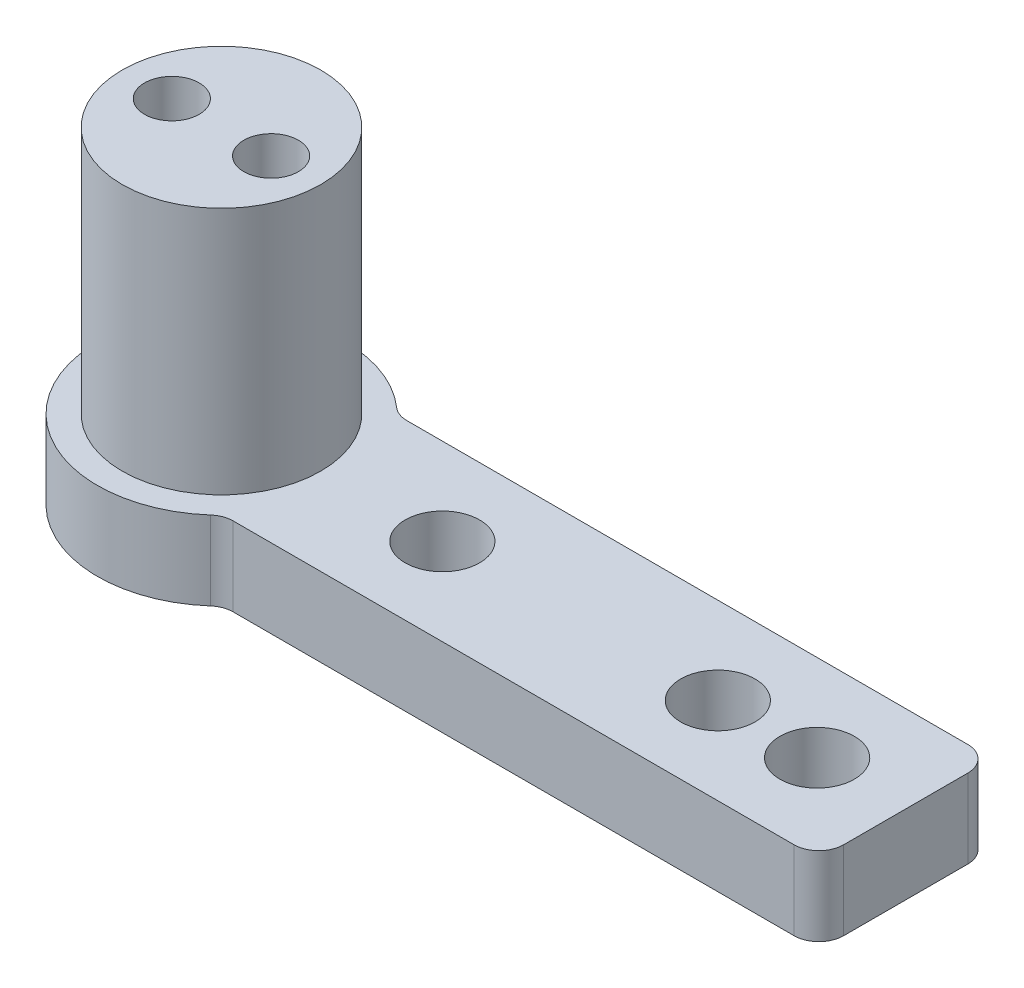
ISO-10303-21;
HEADER;
FILE_DESCRIPTION(('STEP AP214'),'2;1');
FILE_NAME('part.step','',(''),(''),'','','');
FILE_SCHEMA(('AUTOMOTIVE_DESIGN { 1 0 10303 214 1 1 1 1 }'));
ENDSEC;
DATA;
#1=APPLICATION_CONTEXT('core data for automotive mechanical design processes');
#2=APPLICATION_PROTOCOL_DEFINITION('international standard','automotive_design',2000,#1);
#3=PRODUCT_CONTEXT('',#1,'mechanical');
#4=PRODUCT('Part','Part','',(#3));
#5=PRODUCT_RELATED_PRODUCT_CATEGORY('part','',(#4));
#6=PRODUCT_DEFINITION_FORMATION('','',#4);
#7=PRODUCT_DEFINITION_CONTEXT('part definition',#1,'design');
#8=PRODUCT_DEFINITION('design','',#6,#7);
#9=PRODUCT_DEFINITION_SHAPE('','',#8);
#10=(LENGTH_UNIT() NAMED_UNIT(*) SI_UNIT(.MILLI.,.METRE.));
#11=(NAMED_UNIT(*) PLANE_ANGLE_UNIT() SI_UNIT($,.RADIAN.));
#12=(NAMED_UNIT(*) SI_UNIT($,.STERADIAN.) SOLID_ANGLE_UNIT());
#13=UNCERTAINTY_MEASURE_WITH_UNIT(LENGTH_MEASURE(1.E-05),#10,'distance_accuracy_value','');
#14=(GEOMETRIC_REPRESENTATION_CONTEXT(3) GLOBAL_UNCERTAINTY_ASSIGNED_CONTEXT((#13)) GLOBAL_UNIT_ASSIGNED_CONTEXT((#10,
#11,#12)) REPRESENTATION_CONTEXT('',''));
#15=CARTESIAN_POINT('',(0.,0.,0.));
#16=DIRECTION('',(0.,0.,1.));
#17=DIRECTION('',(1.,0.,0.));
#18=AXIS2_PLACEMENT_3D('',#15,#16,#17);
#19=CARTESIAN_POINT('',(0.,3.175,0.));
#20=DIRECTION('',(0.,1.,0.));
#21=DIRECTION('',(0.,0.,1.));
#22=AXIS2_PLACEMENT_3D('',#19,#20,#21);
#23=PLANE('',#22);
#24=CARTESIAN_POINT('',(0.,3.175,0.));
#25=DIRECTION('',(0.,1.,0.));
#26=DIRECTION('',(0.,0.,1.));
#27=AXIS2_PLACEMENT_3D('',#24,#25,#26);
#28=CIRCLE('',#27,4.);
#29=CARTESIAN_POINT('',(0.,3.175,4.));
#30=VERTEX_POINT('',#29);
#31=EDGE_CURVE('E190',#30,#30,#28,.T.);
#32=ORIENTED_EDGE('',*,*,#31,.F.);
#33=EDGE_LOOP('',(#32));
#34=FACE_BOUND('',#33,.T.);
#35=CARTESIAN_POINT('',(20.,3.175,0.));
#36=DIRECTION('',(0.,1.,0.));
#37=DIRECTION('',(0.,0.,1.));
#38=AXIS2_PLACEMENT_3D('',#35,#36,#37);
#39=CIRCLE('',#38,1.5);
#40=CARTESIAN_POINT('',(20.,3.175,1.5));
#41=VERTEX_POINT('',#40);
#42=EDGE_CURVE('E176',#41,#41,#39,.T.);
#43=ORIENTED_EDGE('',*,*,#42,.F.);
#44=EDGE_LOOP('',(#43));
#45=FACE_BOUND('',#44,.T.);
#46=DIRECTION('',(0.,0.,-1.));
#47=VECTOR('',#46,1.);
#48=CARTESIAN_POINT('',(27.5707142142714,3.175,-3.5));
#49=LINE('',#48,#47);
#50=CARTESIAN_POINT('',(27.5707142142714,3.175,2.5));
#51=VERTEX_POINT('',#50);
#52=CARTESIAN_POINT('',(27.5707142142714,3.175,-2.5));
#53=VERTEX_POINT('',#52);
#54=EDGE_CURVE('E129',#51,#53,#49,.T.);
#55=ORIENTED_EDGE('',*,*,#54,.T.);
#56=CARTESIAN_POINT('',(26.5707142142714,3.175,-2.5));
#57=DIRECTION('',(0.,1.,0.));
#58=DIRECTION('',(0.,0.,1.));
#59=AXIS2_PLACEMENT_3D('',#56,#57,#58);
#60=CIRCLE('',#59,1.);
#61=CARTESIAN_POINT('',(26.5707142142714,3.175,-3.5));
#62=VERTEX_POINT('',#61);
#63=EDGE_CURVE('E109',#53,#62,#60,.T.);
#64=ORIENTED_EDGE('',*,*,#63,.T.);
#65=DIRECTION('',(-1.,0.,0.));
#66=VECTOR('',#65,1.);
#67=CARTESIAN_POINT('',(3.57071421427143,3.175,-3.5));
#68=LINE('',#67,#66);
#69=CARTESIAN_POINT('',(3.96862696659689,3.175,-3.5));
#70=VERTEX_POINT('',#69);
#71=EDGE_CURVE('E159',#62,#70,#68,.T.);
#72=ORIENTED_EDGE('',*,*,#71,.T.);
#73=CARTESIAN_POINT('',(3.96862696659689,3.175,-4.5));
#74=DIRECTION('',(0.,1.,0.));
#75=DIRECTION('',(0.,0.,1.));
#76=AXIS2_PLACEMENT_3D('',#73,#74,#75);
#77=CIRCLE('',#76,1.);
#78=CARTESIAN_POINT('',(3.30718913883074,3.175,-3.75));
#79=VERTEX_POINT('',#78);
#80=EDGE_CURVE('E108',#70,#79,#77,.F.);
#81=ORIENTED_EDGE('',*,*,#80,.T.);
#82=CARTESIAN_POINT('',(0.,3.175,0.));
#83=DIRECTION('',(0.,1.,0.));
#84=DIRECTION('',(0.,0.,1.));
#85=AXIS2_PLACEMENT_3D('',#82,#83,#84);
#86=CIRCLE('',#85,5.);
#87=CARTESIAN_POINT('',(3.30718913883074,3.175,3.75));
#88=VERTEX_POINT('',#87);
#89=EDGE_CURVE('E118',#79,#88,#86,.T.);
#90=ORIENTED_EDGE('',*,*,#89,.T.);
#91=CARTESIAN_POINT('',(3.96862696659689,3.175,4.5));
#92=DIRECTION('',(0.,1.,0.));
#93=DIRECTION('',(0.,0.,1.));
#94=AXIS2_PLACEMENT_3D('',#91,#92,#93);
#95=CIRCLE('',#94,1.);
#96=CARTESIAN_POINT('',(3.96862696659689,3.175,3.5));
#97=VERTEX_POINT('',#96);
#98=EDGE_CURVE('E11',#88,#97,#95,.F.);
#99=ORIENTED_EDGE('',*,*,#98,.T.);
#100=DIRECTION('',(1.,0.,0.));
#101=VECTOR('',#100,1.);
#102=CARTESIAN_POINT('',(3.57071421427143,3.175,3.5));
#103=LINE('',#102,#101);
#104=CARTESIAN_POINT('',(26.5707142142714,3.175,3.5));
#105=VERTEX_POINT('',#104);
#106=EDGE_CURVE('E135',#97,#105,#103,.T.);
#107=ORIENTED_EDGE('',*,*,#106,.T.);
#108=CARTESIAN_POINT('',(26.5707142142714,3.175,2.5));
#109=DIRECTION('',(0.,1.,0.));
#110=DIRECTION('',(0.,0.,1.));
#111=AXIS2_PLACEMENT_3D('',#108,#109,#110);
#112=CIRCLE('',#111,1.);
#113=EDGE_CURVE('E54',#105,#51,#112,.T.);
#114=ORIENTED_EDGE('',*,*,#113,.T.);
#115=EDGE_LOOP('',(#55,#64,#72,#81,#90,#99,#107,#114));
#116=FACE_BOUND('',#115,.T.);
#117=CARTESIAN_POINT('',(8.9,3.175,0.));
#118=DIRECTION('',(0.,1.,0.));
#119=DIRECTION('',(0.,0.,1.));
#120=AXIS2_PLACEMENT_3D('',#117,#118,#119);
#121=CIRCLE('',#120,1.5);
#122=CARTESIAN_POINT('',(8.9,3.175,1.5));
#123=VERTEX_POINT('',#122);
#124=EDGE_CURVE('E168',#123,#123,#121,.T.);
#125=ORIENTED_EDGE('',*,*,#124,.F.);
#126=EDGE_LOOP('',(#125));
#127=FACE_BOUND('',#126,.T.);
#128=CARTESIAN_POINT('',(24.,3.175,0.));
#129=DIRECTION('',(0.,1.,0.));
#130=DIRECTION('',(0.,0.,1.));
#131=AXIS2_PLACEMENT_3D('',#128,#129,#130);
#132=CIRCLE('',#131,1.5);
#133=CARTESIAN_POINT('',(24.,3.175,1.5));
#134=VERTEX_POINT('',#133);
#135=EDGE_CURVE('E181',#134,#134,#132,.T.);
#136=ORIENTED_EDGE('',*,*,#135,.F.);
#137=EDGE_LOOP('',(#136));
#138=FACE_BOUND('',#137,.T.);
#139=ADVANCED_FACE('F32',(#34,#45,#116,#127,#138),#23,.T.);
#140=CARTESIAN_POINT('',(0.,0.,0.));
#141=DIRECTION('',(0.,1.,0.));
#142=DIRECTION('',(0.,0.,1.));
#143=AXIS2_PLACEMENT_3D('',#140,#141,#142);
#144=PLANE('',#143);
#145=DIRECTION('',(-1.,0.,0.));
#146=VECTOR('',#145,1.);
#147=CARTESIAN_POINT('',(3.57071421427143,0.,-3.5));
#148=LINE('',#147,#146);
#149=CARTESIAN_POINT('',(26.5707142142714,0.,-3.5));
#150=VERTEX_POINT('',#149);
#151=CARTESIAN_POINT('',(3.96862696659689,0.,-3.5));
#152=VERTEX_POINT('',#151);
#153=EDGE_CURVE('E126',#150,#152,#148,.T.);
#154=ORIENTED_EDGE('',*,*,#153,.F.);
#155=CARTESIAN_POINT('',(26.5707142142714,0.,-2.5));
#156=DIRECTION('',(0.,1.,0.));
#157=DIRECTION('',(0.,0.,1.));
#158=AXIS2_PLACEMENT_3D('',#155,#156,#157);
#159=CIRCLE('',#158,1.);
#160=CARTESIAN_POINT('',(27.5707142142714,0.,-2.5));
#161=VERTEX_POINT('',#160);
#162=EDGE_CURVE('E147',#150,#161,#159,.F.);
#163=ORIENTED_EDGE('',*,*,#162,.T.);
#164=DIRECTION('',(0.,0.,-1.));
#165=VECTOR('',#164,1.);
#166=CARTESIAN_POINT('',(27.5707142142714,0.,-3.5));
#167=LINE('',#166,#165);
#168=CARTESIAN_POINT('',(27.5707142142714,0.,2.5));
#169=VERTEX_POINT('',#168);
#170=EDGE_CURVE('E131',#169,#161,#167,.T.);
#171=ORIENTED_EDGE('',*,*,#170,.F.);
#172=CARTESIAN_POINT('',(26.5707142142714,0.,2.5));
#173=DIRECTION('',(0.,1.,0.));
#174=DIRECTION('',(0.,0.,1.));
#175=AXIS2_PLACEMENT_3D('',#172,#173,#174);
#176=CIRCLE('',#175,1.);
#177=CARTESIAN_POINT('',(26.5707142142714,0.,3.5));
#178=VERTEX_POINT('',#177);
#179=EDGE_CURVE('E145',#169,#178,#176,.F.);
#180=ORIENTED_EDGE('',*,*,#179,.T.);
#181=DIRECTION('',(1.,0.,0.));
#182=VECTOR('',#181,1.);
#183=CARTESIAN_POINT('',(3.57071421427143,0.,3.5));
#184=LINE('',#183,#182);
#185=CARTESIAN_POINT('',(3.96862696659689,0.,3.5));
#186=VERTEX_POINT('',#185);
#187=EDGE_CURVE('E125',#186,#178,#184,.T.);
#188=ORIENTED_EDGE('',*,*,#187,.F.);
#189=CARTESIAN_POINT('',(3.96862696659689,0.,4.5));
#190=DIRECTION('',(0.,1.,0.));
#191=DIRECTION('',(0.,0.,1.));
#192=AXIS2_PLACEMENT_3D('',#189,#190,#191);
#193=CIRCLE('',#192,1.);
#194=CARTESIAN_POINT('',(3.30718913883074,0.,3.75));
#195=VERTEX_POINT('',#194);
#196=EDGE_CURVE('E40',#186,#195,#193,.T.);
#197=ORIENTED_EDGE('',*,*,#196,.T.);
#198=CARTESIAN_POINT('',(0.,0.,0.));
#199=DIRECTION('',(0.,1.,0.));
#200=DIRECTION('',(0.,0.,1.));
#201=AXIS2_PLACEMENT_3D('',#198,#199,#200);
#202=CIRCLE('',#201,5.);
#203=CARTESIAN_POINT('',(3.30718913883074,0.,-3.75));
#204=VERTEX_POINT('',#203);
#205=EDGE_CURVE('E115',#204,#195,#202,.T.);
#206=ORIENTED_EDGE('',*,*,#205,.F.);
#207=CARTESIAN_POINT('',(3.96862696659689,0.,-4.5));
#208=DIRECTION('',(0.,1.,0.));
#209=DIRECTION('',(0.,0.,1.));
#210=AXIS2_PLACEMENT_3D('',#207,#208,#209);
#211=CIRCLE('',#210,1.);
#212=EDGE_CURVE('E98',#204,#152,#211,.T.);
#213=ORIENTED_EDGE('',*,*,#212,.T.);
#214=EDGE_LOOP('',(#154,#163,#171,#180,#188,#197,#206,#213));
#215=FACE_BOUND('',#214,.T.);
#216=CARTESIAN_POINT('',(8.9,0.,0.));
#217=DIRECTION('',(0.,1.,0.));
#218=DIRECTION('',(0.,0.,1.));
#219=AXIS2_PLACEMENT_3D('',#216,#217,#218);
#220=CIRCLE('',#219,1.5);
#221=CARTESIAN_POINT('',(8.9,0.,1.5));
#222=VERTEX_POINT('',#221);
#223=EDGE_CURVE('E171',#222,#222,#220,.T.);
#224=ORIENTED_EDGE('',*,*,#223,.T.);
#225=EDGE_LOOP('',(#224));
#226=FACE_BOUND('',#225,.T.);
#227=CARTESIAN_POINT('',(20.,0.,0.));
#228=DIRECTION('',(0.,1.,0.));
#229=DIRECTION('',(0.,0.,1.));
#230=AXIS2_PLACEMENT_3D('',#227,#228,#229);
#231=CIRCLE('',#230,1.5);
#232=CARTESIAN_POINT('',(20.,0.,1.5));
#233=VERTEX_POINT('',#232);
#234=EDGE_CURVE('E178',#233,#233,#231,.T.);
#235=ORIENTED_EDGE('',*,*,#234,.T.);
#236=EDGE_LOOP('',(#235));
#237=FACE_BOUND('',#236,.T.);
#238=CARTESIAN_POINT('',(24.,0.,0.));
#239=DIRECTION('',(0.,1.,0.));
#240=DIRECTION('',(0.,0.,1.));
#241=AXIS2_PLACEMENT_3D('',#238,#239,#240);
#242=CIRCLE('',#241,1.5);
#243=CARTESIAN_POINT('',(24.,0.,1.5));
#244=VERTEX_POINT('',#243);
#245=EDGE_CURVE('E184',#244,#244,#242,.T.);
#246=ORIENTED_EDGE('',*,*,#245,.T.);
#247=EDGE_LOOP('',(#246));
#248=FACE_BOUND('',#247,.T.);
#249=ADVANCED_FACE('F122',(#215,#226,#237,#248),#144,.F.);
#250=CARTESIAN_POINT('',(27.5707142142714,3.175,-3.5));
#251=DIRECTION('',(-1.,0.,0.));
#252=DIRECTION('',(0.,0.,1.));
#253=AXIS2_PLACEMENT_3D('',#250,#251,#252);
#254=PLANE('',#253);
#255=ORIENTED_EDGE('',*,*,#170,.T.);
#256=DIRECTION('',(0.,-1.,0.));
#257=VECTOR('',#256,1.);
#258=CARTESIAN_POINT('',(27.5707142142714,3.175,-2.5));
#259=LINE('',#258,#257);
#260=EDGE_CURVE('E47',#161,#53,#259,.F.);
#261=ORIENTED_EDGE('',*,*,#260,.T.);
#262=ORIENTED_EDGE('',*,*,#54,.F.);
#263=DIRECTION('',(0.,-1.,0.));
#264=VECTOR('',#263,1.);
#265=CARTESIAN_POINT('',(27.5707142142714,3.175,2.5));
#266=LINE('',#265,#264);
#267=EDGE_CURVE('E149',#51,#169,#266,.T.);
#268=ORIENTED_EDGE('',*,*,#267,.T.);
#269=EDGE_LOOP('',(#255,#261,#262,#268));
#270=FACE_BOUND('',#269,.T.);
#271=ADVANCED_FACE('F246',(#270),#254,.F.);
#272=CARTESIAN_POINT('',(3.57071421427143,3.175,-3.5));
#273=DIRECTION('',(0.,0.,1.));
#274=DIRECTION('',(1.,0.,0.));
#275=AXIS2_PLACEMENT_3D('',#272,#273,#274);
#276=PLANE('',#275);
#277=ORIENTED_EDGE('',*,*,#153,.T.);
#278=DIRECTION('',(0.,1.,0.));
#279=VECTOR('',#278,1.);
#280=CARTESIAN_POINT('',(3.96862696659689,3.175,-3.5));
#281=LINE('',#280,#279);
#282=EDGE_CURVE('E103',#152,#70,#281,.T.);
#283=ORIENTED_EDGE('',*,*,#282,.T.);
#284=ORIENTED_EDGE('',*,*,#71,.F.);
#285=DIRECTION('',(0.,-1.,0.));
#286=VECTOR('',#285,1.);
#287=CARTESIAN_POINT('',(26.5707142142714,3.175,-3.5));
#288=LINE('',#287,#286);
#289=EDGE_CURVE('E119',#62,#150,#288,.T.);
#290=ORIENTED_EDGE('',*,*,#289,.T.);
#291=EDGE_LOOP('',(#277,#283,#284,#290));
#292=FACE_BOUND('',#291,.T.);
#293=ADVANCED_FACE('F264',(#292),#276,.F.);
#294=CARTESIAN_POINT('',(0.,3.175,0.));
#295=DIRECTION('',(0.,-1.,0.));
#296=DIRECTION('',(0.,0.,-1.));
#297=AXIS2_PLACEMENT_3D('',#294,#295,#296);
#298=CYLINDRICAL_SURFACE('',#297,5.);
#299=ORIENTED_EDGE('',*,*,#89,.F.);
#300=DIRECTION('',(0.,-1.,0.));
#301=VECTOR('',#300,1.);
#302=CARTESIAN_POINT('',(3.30718913883074,3.175,-3.75));
#303=LINE('',#302,#301);
#304=EDGE_CURVE('E102',#79,#204,#303,.T.);
#305=ORIENTED_EDGE('',*,*,#304,.T.);
#306=ORIENTED_EDGE('',*,*,#205,.T.);
#307=DIRECTION('',(0.,-1.,0.));
#308=VECTOR('',#307,1.);
#309=CARTESIAN_POINT('',(3.30718913883074,3.175,3.75));
#310=LINE('',#309,#308);
#311=EDGE_CURVE('E120',#195,#88,#310,.F.);
#312=ORIENTED_EDGE('',*,*,#311,.T.);
#313=EDGE_LOOP('',(#299,#305,#306,#312));
#314=FACE_BOUND('',#313,.T.);
#315=ADVANCED_FACE('F114',(#314),#298,.T.);
#316=CARTESIAN_POINT('',(3.57071421427143,3.175,3.5));
#317=DIRECTION('',(0.,0.,-1.));
#318=DIRECTION('',(-1.,0.,0.));
#319=AXIS2_PLACEMENT_3D('',#316,#317,#318);
#320=PLANE('',#319);
#321=ORIENTED_EDGE('',*,*,#106,.F.);
#322=DIRECTION('',(0.,1.,0.));
#323=VECTOR('',#322,1.);
#324=CARTESIAN_POINT('',(3.96862696659689,0.,3.5));
#325=LINE('',#324,#323);
#326=EDGE_CURVE('E142',#97,#186,#325,.F.);
#327=ORIENTED_EDGE('',*,*,#326,.T.);
#328=ORIENTED_EDGE('',*,*,#187,.T.);
#329=DIRECTION('',(0.,-1.,0.));
#330=VECTOR('',#329,1.);
#331=CARTESIAN_POINT('',(26.5707142142714,3.175,3.5));
#332=LINE('',#331,#330);
#333=EDGE_CURVE('E140',#178,#105,#332,.F.);
#334=ORIENTED_EDGE('',*,*,#333,.T.);
#335=EDGE_LOOP('',(#321,#327,#328,#334));
#336=FACE_BOUND('',#335,.T.);
#337=ADVANCED_FACE('F257',(#336),#320,.F.);
#338=CARTESIAN_POINT('',(8.9,3.175,0.));
#339=DIRECTION('',(0.,-1.,0.));
#340=DIRECTION('',(0.,0.,-1.));
#341=AXIS2_PLACEMENT_3D('',#338,#339,#340);
#342=CYLINDRICAL_SURFACE('',#341,1.5);
#343=ORIENTED_EDGE('',*,*,#124,.T.);
#344=EDGE_LOOP('',(#343));
#345=FACE_BOUND('',#344,.T.);
#346=ORIENTED_EDGE('',*,*,#223,.F.);
#347=EDGE_LOOP('',(#346));
#348=FACE_BOUND('',#347,.T.);
#349=ADVANCED_FACE('F240',(#345,#348),#342,.F.);
#350=CARTESIAN_POINT('',(20.,3.175,0.));
#351=DIRECTION('',(0.,-1.,0.));
#352=DIRECTION('',(0.,0.,-1.));
#353=AXIS2_PLACEMENT_3D('',#350,#351,#352);
#354=CYLINDRICAL_SURFACE('',#353,1.5);
#355=ORIENTED_EDGE('',*,*,#42,.T.);
#356=EDGE_LOOP('',(#355));
#357=FACE_BOUND('',#356,.T.);
#358=ORIENTED_EDGE('',*,*,#234,.F.);
#359=EDGE_LOOP('',(#358));
#360=FACE_BOUND('',#359,.T.);
#361=ADVANCED_FACE('F237',(#357,#360),#354,.F.);
#362=CARTESIAN_POINT('',(24.,3.175,0.));
#363=DIRECTION('',(0.,-1.,0.));
#364=DIRECTION('',(0.,0.,-1.));
#365=AXIS2_PLACEMENT_3D('',#362,#363,#364);
#366=CYLINDRICAL_SURFACE('',#365,1.5);
#367=ORIENTED_EDGE('',*,*,#135,.T.);
#368=EDGE_LOOP('',(#367));
#369=FACE_BOUND('',#368,.T.);
#370=ORIENTED_EDGE('',*,*,#245,.F.);
#371=EDGE_LOOP('',(#370));
#372=FACE_BOUND('',#371,.T.);
#373=ADVANCED_FACE('F228',(#369,#372),#366,.F.);
#374=CARTESIAN_POINT('',(0.,13.175,0.));
#375=DIRECTION('',(0.,-1.,0.));
#376=DIRECTION('',(0.,0.,-1.));
#377=AXIS2_PLACEMENT_3D('',#374,#375,#376);
#378=CYLINDRICAL_SURFACE('',#377,4.);
#379=CARTESIAN_POINT('',(0.,13.175,0.));
#380=DIRECTION('',(0.,1.,0.));
#381=DIRECTION('',(0.,0.,1.));
#382=AXIS2_PLACEMENT_3D('',#379,#380,#381);
#383=CIRCLE('',#382,4.);
#384=CARTESIAN_POINT('',(0.,13.175,4.));
#385=VERTEX_POINT('',#384);
#386=EDGE_CURVE('E187',#385,#385,#383,.T.);
#387=ORIENTED_EDGE('',*,*,#386,.F.);
#388=EDGE_LOOP('',(#387));
#389=FACE_BOUND('',#388,.T.);
#390=ORIENTED_EDGE('',*,*,#31,.T.);
#391=EDGE_LOOP('',(#390));
#392=FACE_BOUND('',#391,.T.);
#393=ADVANCED_FACE('F220',(#389,#392),#378,.T.);
#394=CARTESIAN_POINT('',(0.,13.175,0.));
#395=DIRECTION('',(0.,1.,0.));
#396=DIRECTION('',(0.,0.,1.));
#397=AXIS2_PLACEMENT_3D('',#394,#395,#396);
#398=PLANE('',#397);
#399=CARTESIAN_POINT('',(2.,13.175,0.));
#400=DIRECTION('',(0.,1.,0.));
#401=DIRECTION('',(0.,0.,1.));
#402=AXIS2_PLACEMENT_3D('',#399,#400,#401);
#403=CIRCLE('',#402,1.1);
#404=CARTESIAN_POINT('',(2.,13.175,1.1));
#405=VERTEX_POINT('',#404);
#406=EDGE_CURVE('E202',#405,#405,#403,.T.);
#407=ORIENTED_EDGE('',*,*,#406,.F.);
#408=EDGE_LOOP('',(#407));
#409=FACE_BOUND('',#408,.T.);
#410=CARTESIAN_POINT('',(-2.,13.175,0.));
#411=DIRECTION('',(0.,1.,0.));
#412=DIRECTION('',(0.,0.,1.));
#413=AXIS2_PLACEMENT_3D('',#410,#411,#412);
#414=CIRCLE('',#413,1.1);
#415=CARTESIAN_POINT('',(-2.,13.175,1.1));
#416=VERTEX_POINT('',#415);
#417=EDGE_CURVE('E196',#416,#416,#414,.T.);
#418=ORIENTED_EDGE('',*,*,#417,.F.);
#419=EDGE_LOOP('',(#418));
#420=FACE_BOUND('',#419,.T.);
#421=ORIENTED_EDGE('',*,*,#386,.T.);
#422=EDGE_LOOP('',(#421));
#423=FACE_BOUND('',#422,.T.);
#424=ADVANCED_FACE('F217',(#409,#420,#423),#398,.T.);
#425=CARTESIAN_POINT('',(3.96862696659689,3.175,-4.5));
#426=DIRECTION('',(0.,-1.,0.));
#427=DIRECTION('',(0.,0.,-1.));
#428=AXIS2_PLACEMENT_3D('',#425,#426,#427);
#429=CYLINDRICAL_SURFACE('',#428,1.);
#430=ORIENTED_EDGE('',*,*,#80,.F.);
#431=ORIENTED_EDGE('',*,*,#282,.F.);
#432=ORIENTED_EDGE('',*,*,#212,.F.);
#433=ORIENTED_EDGE('',*,*,#304,.F.);
#434=EDGE_LOOP('',(#430,#431,#432,#433));
#435=FACE_BOUND('',#434,.T.);
#436=ADVANCED_FACE('F101',(#435),#429,.F.);
#437=CARTESIAN_POINT('',(3.96862696659689,3.175,4.5));
#438=DIRECTION('',(0.,-1.,0.));
#439=DIRECTION('',(0.,0.,-1.));
#440=AXIS2_PLACEMENT_3D('',#437,#438,#439);
#441=CYLINDRICAL_SURFACE('',#440,1.);
#442=ORIENTED_EDGE('',*,*,#98,.F.);
#443=ORIENTED_EDGE('',*,*,#311,.F.);
#444=ORIENTED_EDGE('',*,*,#196,.F.);
#445=ORIENTED_EDGE('',*,*,#326,.F.);
#446=EDGE_LOOP('',(#442,#443,#444,#445));
#447=FACE_BOUND('',#446,.T.);
#448=ADVANCED_FACE('F271',(#447),#441,.F.);
#449=CARTESIAN_POINT('',(26.5707142142714,3.175,-2.5));
#450=DIRECTION('',(0.,-1.,0.));
#451=DIRECTION('',(0.,0.,-1.));
#452=AXIS2_PLACEMENT_3D('',#449,#450,#451);
#453=CYLINDRICAL_SURFACE('',#452,1.);
#454=ORIENTED_EDGE('',*,*,#63,.F.);
#455=ORIENTED_EDGE('',*,*,#260,.F.);
#456=ORIENTED_EDGE('',*,*,#162,.F.);
#457=ORIENTED_EDGE('',*,*,#289,.F.);
#458=EDGE_LOOP('',(#454,#455,#456,#457));
#459=FACE_BOUND('',#458,.T.);
#460=ADVANCED_FACE('F273',(#459),#453,.T.);
#461=CARTESIAN_POINT('',(26.5707142142714,3.175,2.5));
#462=DIRECTION('',(0.,-1.,0.));
#463=DIRECTION('',(0.,0.,-1.));
#464=AXIS2_PLACEMENT_3D('',#461,#462,#463);
#465=CYLINDRICAL_SURFACE('',#464,1.);
#466=ORIENTED_EDGE('',*,*,#113,.F.);
#467=ORIENTED_EDGE('',*,*,#333,.F.);
#468=ORIENTED_EDGE('',*,*,#179,.F.);
#469=ORIENTED_EDGE('',*,*,#267,.F.);
#470=EDGE_LOOP('',(#466,#467,#468,#469));
#471=FACE_BOUND('',#470,.T.);
#472=ADVANCED_FACE('F34',(#471),#465,.T.);
#473=CARTESIAN_POINT('',(-2.,8.175,0.));
#474=DIRECTION('',(0.,1.,0.));
#475=DIRECTION('',(0.,0.,1.));
#476=AXIS2_PLACEMENT_3D('',#473,#474,#475);
#477=CYLINDRICAL_SURFACE('',#476,1.1);
#478=CARTESIAN_POINT('',(-2.,8.175,0.));
#479=DIRECTION('',(0.,1.,0.));
#480=DIRECTION('',(0.,0.,1.));
#481=AXIS2_PLACEMENT_3D('',#478,#479,#480);
#482=CIRCLE('',#481,1.1);
#483=CARTESIAN_POINT('',(-2.,8.175,1.1));
#484=VERTEX_POINT('',#483);
#485=EDGE_CURVE('E199',#484,#484,#482,.T.);
#486=ORIENTED_EDGE('',*,*,#485,.F.);
#487=EDGE_LOOP('',(#486));
#488=FACE_BOUND('',#487,.T.);
#489=ORIENTED_EDGE('',*,*,#417,.T.);
#490=EDGE_LOOP('',(#489));
#491=FACE_BOUND('',#490,.T.);
#492=ADVANCED_FACE('F280',(#488,#491),#477,.F.);
#493=CARTESIAN_POINT('',(-2.,8.175,0.));
#494=DIRECTION('',(0.,1.,0.));
#495=DIRECTION('',(0.,0.,1.));
#496=AXIS2_PLACEMENT_3D('',#493,#494,#495);
#497=PLANE('',#496);
#498=ORIENTED_EDGE('',*,*,#485,.T.);
#499=EDGE_LOOP('',(#498));
#500=FACE_BOUND('',#499,.T.);
#501=ADVANCED_FACE('F213',(#500),#497,.T.);
#502=CARTESIAN_POINT('',(2.,8.175,0.));
#503=DIRECTION('',(0.,1.,0.));
#504=DIRECTION('',(0.,0.,1.));
#505=AXIS2_PLACEMENT_3D('',#502,#503,#504);
#506=CYLINDRICAL_SURFACE('',#505,1.1);
#507=CARTESIAN_POINT('',(2.,8.175,0.));
#508=DIRECTION('',(0.,1.,0.));
#509=DIRECTION('',(0.,0.,1.));
#510=AXIS2_PLACEMENT_3D('',#507,#508,#509);
#511=CIRCLE('',#510,1.1);
#512=CARTESIAN_POINT('',(2.,8.175,1.1));
#513=VERTEX_POINT('',#512);
#514=EDGE_CURVE('E193',#513,#513,#511,.T.);
#515=ORIENTED_EDGE('',*,*,#514,.F.);
#516=EDGE_LOOP('',(#515));
#517=FACE_BOUND('',#516,.T.);
#518=ORIENTED_EDGE('',*,*,#406,.T.);
#519=EDGE_LOOP('',(#518));
#520=FACE_BOUND('',#519,.T.);
#521=ADVANCED_FACE('F210',(#517,#520),#506,.F.);
#522=CARTESIAN_POINT('',(2.,8.175,0.));
#523=DIRECTION('',(0.,1.,0.));
#524=DIRECTION('',(0.,0.,1.));
#525=AXIS2_PLACEMENT_3D('',#522,#523,#524);
#526=PLANE('',#525);
#527=ORIENTED_EDGE('',*,*,#514,.T.);
#528=EDGE_LOOP('',(#527));
#529=FACE_BOUND('',#528,.T.);
#530=ADVANCED_FACE('F208',(#529),#526,.T.);
#531=CLOSED_SHELL('',(#139,#249,#271,#293,#315,#337,#349,#361,#373,#393,#424,#436,#448,#460,
#472,#492,#501,#521,#530));
#532=MANIFOLD_SOLID_BREP('B2',#531);
#533=ADVANCED_BREP_SHAPE_REPRESENTATION('',(#18,#532),#14);
#534=SHAPE_DEFINITION_REPRESENTATION(#9,#533);
ENDSEC;
END-ISO-10303-21;
